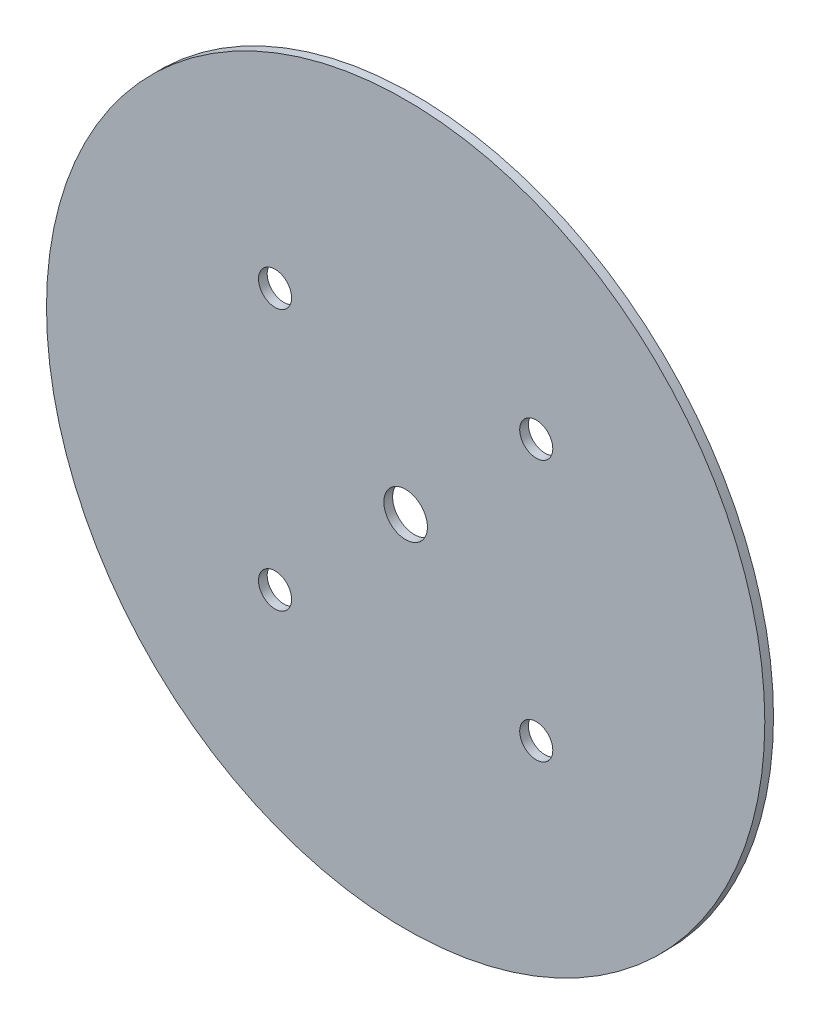
ISO-10303-21;
HEADER;
FILE_DESCRIPTION(('STEP AP214'),'2;1');
FILE_NAME('part.step','',(''),(''),'','','');
FILE_SCHEMA(('AUTOMOTIVE_DESIGN { 1 0 10303 214 1 1 1 1 }'));
ENDSEC;
DATA;
#1=APPLICATION_CONTEXT('core data for automotive mechanical design processes');
#2=APPLICATION_PROTOCOL_DEFINITION('international standard','automotive_design',2000,#1);
#3=PRODUCT_CONTEXT('',#1,'mechanical');
#4=PRODUCT('Part','Part','',(#3));
#5=PRODUCT_RELATED_PRODUCT_CATEGORY('part','',(#4));
#6=PRODUCT_DEFINITION_FORMATION('','',#4);
#7=PRODUCT_DEFINITION_CONTEXT('part definition',#1,'design');
#8=PRODUCT_DEFINITION('design','',#6,#7);
#9=PRODUCT_DEFINITION_SHAPE('','',#8);
#10=(LENGTH_UNIT() NAMED_UNIT(*) SI_UNIT(.MILLI.,.METRE.));
#11=(NAMED_UNIT(*) PLANE_ANGLE_UNIT() SI_UNIT($,.RADIAN.));
#12=(NAMED_UNIT(*) SI_UNIT($,.STERADIAN.) SOLID_ANGLE_UNIT());
#13=UNCERTAINTY_MEASURE_WITH_UNIT(LENGTH_MEASURE(1.E-05),#10,'distance_accuracy_value','');
#14=(GEOMETRIC_REPRESENTATION_CONTEXT(3) GLOBAL_UNCERTAINTY_ASSIGNED_CONTEXT((#13)) GLOBAL_UNIT_ASSIGNED_CONTEXT((#10,
#11,#12)) REPRESENTATION_CONTEXT('',''));
#15=CARTESIAN_POINT('',(0.,0.,0.));
#16=DIRECTION('',(0.,0.,1.));
#17=DIRECTION('',(1.,0.,0.));
#18=AXIS2_PLACEMENT_3D('',#15,#16,#17);
#19=CARTESIAN_POINT('',(0.,0.,2.));
#20=DIRECTION('',(0.,0.,-1.));
#21=DIRECTION('',(-1.,0.,0.));
#22=AXIS2_PLACEMENT_3D('',#19,#20,#21);
#23=CYLINDRICAL_SURFACE('',#22,82.5);
#24=CARTESIAN_POINT('',(0.,0.,2.));
#25=DIRECTION('',(0.,0.,1.));
#26=DIRECTION('',(1.,0.,0.));
#27=AXIS2_PLACEMENT_3D('',#24,#25,#26);
#28=CIRCLE('',#27,82.5);
#29=CARTESIAN_POINT('',(82.5,0.,2.));
#30=VERTEX_POINT('',#29);
#31=EDGE_CURVE('E10',#30,#30,#28,.T.);
#32=ORIENTED_EDGE('',*,*,#31,.F.);
#33=EDGE_LOOP('',(#32));
#34=FACE_BOUND('',#33,.T.);
#35=CARTESIAN_POINT('',(0.,0.,0.));
#36=DIRECTION('',(0.,0.,1.));
#37=DIRECTION('',(1.,0.,0.));
#38=AXIS2_PLACEMENT_3D('',#35,#36,#37);
#39=CIRCLE('',#38,82.5);
#40=CARTESIAN_POINT('',(82.5,0.,0.));
#41=VERTEX_POINT('',#40);
#42=EDGE_CURVE('E36',#41,#41,#39,.T.);
#43=ORIENTED_EDGE('',*,*,#42,.T.);
#44=EDGE_LOOP('',(#43));
#45=FACE_BOUND('',#44,.T.);
#46=ADVANCED_FACE('F33',(#34,#45),#23,.T.);
#47=CARTESIAN_POINT('',(0.,0.,2.));
#48=DIRECTION('',(0.,0.,1.));
#49=DIRECTION('',(1.,0.,0.));
#50=AXIS2_PLACEMENT_3D('',#47,#48,#49);
#51=PLANE('',#50);
#52=CARTESIAN_POINT('',(0.,0.,2.));
#53=DIRECTION('',(0.,0.,1.));
#54=DIRECTION('',(1.,0.,0.));
#55=AXIS2_PLACEMENT_3D('',#52,#53,#54);
#56=CIRCLE('',#55,5.);
#57=CARTESIAN_POINT('',(5.,0.,2.));
#58=VERTEX_POINT('',#57);
#59=EDGE_CURVE('E51',#58,#58,#56,.T.);
#60=ORIENTED_EDGE('',*,*,#59,.F.);
#61=EDGE_LOOP('',(#60));
#62=FACE_BOUND('',#61,.T.);
#63=CARTESIAN_POINT('',(30.,-30.,2.));
#64=DIRECTION('',(0.,0.,1.));
#65=DIRECTION('',(1.,0.,0.));
#66=AXIS2_PLACEMENT_3D('',#63,#64,#65);
#67=CIRCLE('',#66,3.8);
#68=CARTESIAN_POINT('',(33.8,-30.,2.));
#69=VERTEX_POINT('',#68);
#70=EDGE_CURVE('E57',#69,#69,#67,.T.);
#71=ORIENTED_EDGE('',*,*,#70,.F.);
#72=EDGE_LOOP('',(#71));
#73=FACE_BOUND('',#72,.T.);
#74=CARTESIAN_POINT('',(-30.,-30.,2.));
#75=DIRECTION('',(0.,0.,1.));
#76=DIRECTION('',(1.,0.,0.));
#77=AXIS2_PLACEMENT_3D('',#74,#75,#76);
#78=CIRCLE('',#77,3.8);
#79=CARTESIAN_POINT('',(-26.2,-30.,2.));
#80=VERTEX_POINT('',#79);
#81=EDGE_CURVE('E63',#80,#80,#78,.T.);
#82=ORIENTED_EDGE('',*,*,#81,.F.);
#83=EDGE_LOOP('',(#82));
#84=FACE_BOUND('',#83,.T.);
#85=CARTESIAN_POINT('',(-30.,30.,2.));
#86=DIRECTION('',(0.,0.,1.));
#87=DIRECTION('',(1.,0.,0.));
#88=AXIS2_PLACEMENT_3D('',#85,#86,#87);
#89=CIRCLE('',#88,3.8);
#90=CARTESIAN_POINT('',(-26.2,30.,2.));
#91=VERTEX_POINT('',#90);
#92=EDGE_CURVE('E69',#91,#91,#89,.T.);
#93=ORIENTED_EDGE('',*,*,#92,.F.);
#94=EDGE_LOOP('',(#93));
#95=FACE_BOUND('',#94,.T.);
#96=CARTESIAN_POINT('',(30.,30.,2.));
#97=DIRECTION('',(0.,0.,1.));
#98=DIRECTION('',(1.,0.,0.));
#99=AXIS2_PLACEMENT_3D('',#96,#97,#98);
#100=CIRCLE('',#99,3.8);
#101=CARTESIAN_POINT('',(33.8,30.,2.));
#102=VERTEX_POINT('',#101);
#103=EDGE_CURVE('E45',#102,#102,#100,.T.);
#104=ORIENTED_EDGE('',*,*,#103,.F.);
#105=EDGE_LOOP('',(#104));
#106=FACE_BOUND('',#105,.T.);
#107=ORIENTED_EDGE('',*,*,#31,.T.);
#108=EDGE_LOOP('',(#107));
#109=FACE_BOUND('',#108,.T.);
#110=ADVANCED_FACE('F86',(#62,#73,#84,#95,#106,#109),#51,.T.);
#111=CARTESIAN_POINT('',(0.,0.,0.));
#112=DIRECTION('',(0.,0.,1.));
#113=DIRECTION('',(1.,0.,0.));
#114=AXIS2_PLACEMENT_3D('',#111,#112,#113);
#115=PLANE('',#114);
#116=CARTESIAN_POINT('',(0.,0.,0.));
#117=DIRECTION('',(0.,0.,1.));
#118=DIRECTION('',(1.,0.,0.));
#119=AXIS2_PLACEMENT_3D('',#116,#117,#118);
#120=CIRCLE('',#119,5.);
#121=CARTESIAN_POINT('',(5.,0.,0.));
#122=VERTEX_POINT('',#121);
#123=EDGE_CURVE('E54',#122,#122,#120,.T.);
#124=ORIENTED_EDGE('',*,*,#123,.T.);
#125=EDGE_LOOP('',(#124));
#126=FACE_BOUND('',#125,.T.);
#127=CARTESIAN_POINT('',(30.,-30.,0.));
#128=DIRECTION('',(0.,0.,1.));
#129=DIRECTION('',(1.,0.,0.));
#130=AXIS2_PLACEMENT_3D('',#127,#128,#129);
#131=CIRCLE('',#130,3.8);
#132=CARTESIAN_POINT('',(33.8,-30.,0.));
#133=VERTEX_POINT('',#132);
#134=EDGE_CURVE('E60',#133,#133,#131,.T.);
#135=ORIENTED_EDGE('',*,*,#134,.T.);
#136=EDGE_LOOP('',(#135));
#137=FACE_BOUND('',#136,.T.);
#138=CARTESIAN_POINT('',(-30.,-30.,0.));
#139=DIRECTION('',(0.,0.,1.));
#140=DIRECTION('',(1.,0.,0.));
#141=AXIS2_PLACEMENT_3D('',#138,#139,#140);
#142=CIRCLE('',#141,3.8);
#143=CARTESIAN_POINT('',(-26.2,-30.,0.));
#144=VERTEX_POINT('',#143);
#145=EDGE_CURVE('E66',#144,#144,#142,.T.);
#146=ORIENTED_EDGE('',*,*,#145,.T.);
#147=EDGE_LOOP('',(#146));
#148=FACE_BOUND('',#147,.T.);
#149=CARTESIAN_POINT('',(-30.,30.,0.));
#150=DIRECTION('',(0.,0.,1.));
#151=DIRECTION('',(1.,0.,0.));
#152=AXIS2_PLACEMENT_3D('',#149,#150,#151);
#153=CIRCLE('',#152,3.8);
#154=CARTESIAN_POINT('',(-26.2,30.,0.));
#155=VERTEX_POINT('',#154);
#156=EDGE_CURVE('E48',#155,#155,#153,.T.);
#157=ORIENTED_EDGE('',*,*,#156,.T.);
#158=EDGE_LOOP('',(#157));
#159=FACE_BOUND('',#158,.T.);
#160=CARTESIAN_POINT('',(30.,30.,0.));
#161=DIRECTION('',(0.,0.,1.));
#162=DIRECTION('',(1.,0.,0.));
#163=AXIS2_PLACEMENT_3D('',#160,#161,#162);
#164=CIRCLE('',#163,3.8);
#165=CARTESIAN_POINT('',(33.8,30.,0.));
#166=VERTEX_POINT('',#165);
#167=EDGE_CURVE('E43',#166,#166,#164,.T.);
#168=ORIENTED_EDGE('',*,*,#167,.T.);
#169=EDGE_LOOP('',(#168));
#170=FACE_BOUND('',#169,.T.);
#171=ORIENTED_EDGE('',*,*,#42,.F.);
#172=EDGE_LOOP('',(#171));
#173=FACE_BOUND('',#172,.T.);
#174=ADVANCED_FACE('F75',(#126,#137,#148,#159,#170,#173),#115,.F.);
#175=CARTESIAN_POINT('',(30.,30.,0.));
#176=DIRECTION('',(0.,0.,1.));
#177=DIRECTION('',(1.,0.,0.));
#178=AXIS2_PLACEMENT_3D('',#175,#176,#177);
#179=CYLINDRICAL_SURFACE('',#178,3.8);
#180=ORIENTED_EDGE('',*,*,#167,.F.);
#181=EDGE_LOOP('',(#180));
#182=FACE_BOUND('',#181,.T.);
#183=ORIENTED_EDGE('',*,*,#103,.T.);
#184=EDGE_LOOP('',(#183));
#185=FACE_BOUND('',#184,.T.);
#186=ADVANCED_FACE('F82',(#182,#185),#179,.F.);
#187=CARTESIAN_POINT('',(-30.,30.,0.));
#188=DIRECTION('',(0.,0.,1.));
#189=DIRECTION('',(1.,0.,0.));
#190=AXIS2_PLACEMENT_3D('',#187,#188,#189);
#191=CYLINDRICAL_SURFACE('',#190,3.8);
#192=ORIENTED_EDGE('',*,*,#156,.F.);
#193=EDGE_LOOP('',(#192));
#194=FACE_BOUND('',#193,.T.);
#195=ORIENTED_EDGE('',*,*,#92,.T.);
#196=EDGE_LOOP('',(#195));
#197=FACE_BOUND('',#196,.T.);
#198=ADVANCED_FACE('F78',(#194,#197),#191,.F.);
#199=CARTESIAN_POINT('',(-30.,-30.,0.));
#200=DIRECTION('',(0.,0.,1.));
#201=DIRECTION('',(1.,0.,0.));
#202=AXIS2_PLACEMENT_3D('',#199,#200,#201);
#203=CYLINDRICAL_SURFACE('',#202,3.8);
#204=ORIENTED_EDGE('',*,*,#145,.F.);
#205=EDGE_LOOP('',(#204));
#206=FACE_BOUND('',#205,.T.);
#207=ORIENTED_EDGE('',*,*,#81,.T.);
#208=EDGE_LOOP('',(#207));
#209=FACE_BOUND('',#208,.T.);
#210=ADVANCED_FACE('F81',(#206,#209),#203,.F.);
#211=CARTESIAN_POINT('',(30.,-30.,0.));
#212=DIRECTION('',(0.,0.,1.));
#213=DIRECTION('',(1.,0.,0.));
#214=AXIS2_PLACEMENT_3D('',#211,#212,#213);
#215=CYLINDRICAL_SURFACE('',#214,3.8);
#216=ORIENTED_EDGE('',*,*,#134,.F.);
#217=EDGE_LOOP('',(#216));
#218=FACE_BOUND('',#217,.T.);
#219=ORIENTED_EDGE('',*,*,#70,.T.);
#220=EDGE_LOOP('',(#219));
#221=FACE_BOUND('',#220,.T.);
#222=ADVANCED_FACE('F136',(#218,#221),#215,.F.);
#223=CARTESIAN_POINT('',(0.,0.,0.));
#224=DIRECTION('',(0.,0.,1.));
#225=DIRECTION('',(1.,0.,0.));
#226=AXIS2_PLACEMENT_3D('',#223,#224,#225);
#227=CYLINDRICAL_SURFACE('',#226,5.);
#228=ORIENTED_EDGE('',*,*,#123,.F.);
#229=EDGE_LOOP('',(#228));
#230=FACE_BOUND('',#229,.T.);
#231=ORIENTED_EDGE('',*,*,#59,.T.);
#232=EDGE_LOOP('',(#231));
#233=FACE_BOUND('',#232,.T.);
#234=ADVANCED_FACE('F146',(#230,#233),#227,.F.);
#235=CLOSED_SHELL('',(#46,#110,#174,#186,#198,#210,#222,#234));
#236=MANIFOLD_SOLID_BREP('B2',#235);
#237=ADVANCED_BREP_SHAPE_REPRESENTATION('',(#18,#236),#14);
#238=SHAPE_DEFINITION_REPRESENTATION(#9,#237);
ENDSEC;
END-ISO-10303-21;
